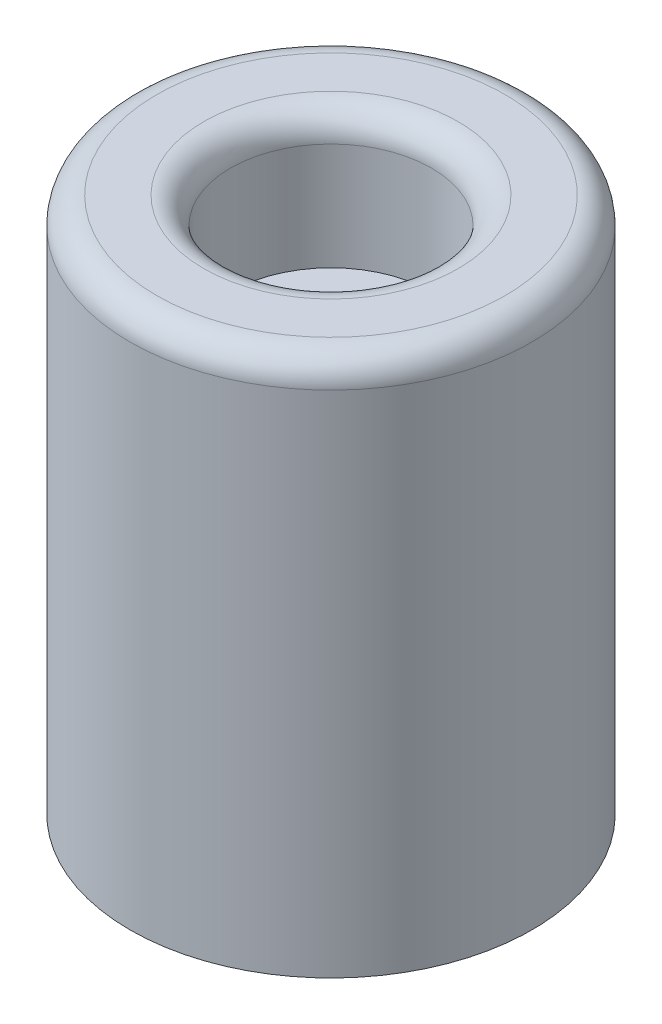
ISO-10303-21;
HEADER;
FILE_DESCRIPTION(('STEP AP214'),'2;1');
FILE_NAME('part.step','',(''),(''),'','','');
FILE_SCHEMA(('AUTOMOTIVE_DESIGN { 1 0 10303 214 1 1 1 1 }'));
ENDSEC;
DATA;
#1=APPLICATION_CONTEXT('core data for automotive mechanical design processes');
#2=APPLICATION_PROTOCOL_DEFINITION('international standard','automotive_design',2000,#1);
#3=PRODUCT_CONTEXT('',#1,'mechanical');
#4=PRODUCT('Part','Part','',(#3));
#5=PRODUCT_RELATED_PRODUCT_CATEGORY('part','',(#4));
#6=PRODUCT_DEFINITION_FORMATION('','',#4);
#7=PRODUCT_DEFINITION_CONTEXT('part definition',#1,'design');
#8=PRODUCT_DEFINITION('design','',#6,#7);
#9=PRODUCT_DEFINITION_SHAPE('','',#8);
#10=(LENGTH_UNIT() NAMED_UNIT(*) SI_UNIT(.MILLI.,.METRE.));
#11=(NAMED_UNIT(*) PLANE_ANGLE_UNIT() SI_UNIT($,.RADIAN.));
#12=(NAMED_UNIT(*) SI_UNIT($,.STERADIAN.) SOLID_ANGLE_UNIT());
#13=UNCERTAINTY_MEASURE_WITH_UNIT(LENGTH_MEASURE(1.E-05),#10,'distance_accuracy_value','');
#14=(GEOMETRIC_REPRESENTATION_CONTEXT(3) GLOBAL_UNCERTAINTY_ASSIGNED_CONTEXT((#13)) GLOBAL_UNIT_ASSIGNED_CONTEXT((#10,
#11,#12)) REPRESENTATION_CONTEXT('',''));
#15=CARTESIAN_POINT('',(0.,0.,0.));
#16=DIRECTION('',(0.,0.,1.));
#17=DIRECTION('',(1.,0.,0.));
#18=AXIS2_PLACEMENT_3D('',#15,#16,#17);
#19=CARTESIAN_POINT('',(0.,25.4,0.));
#20=DIRECTION('',(0.,-1.,0.));
#21=DIRECTION('',(0.,0.,-1.));
#22=AXIS2_PLACEMENT_3D('',#19,#20,#21);
#23=CYLINDRICAL_SURFACE('',#22,9.525);
#24=CARTESIAN_POINT('',(0.,24.13,0.));
#25=DIRECTION('',(0.,1.,0.));
#26=DIRECTION('',(0.,0.,1.));
#27=AXIS2_PLACEMENT_3D('',#24,#25,#26);
#28=CIRCLE('',#27,9.525);
#29=CARTESIAN_POINT('',(0.,24.13,9.525));
#30=VERTEX_POINT('',#29);
#31=EDGE_CURVE('E10',#30,#30,#28,.F.);
#32=ORIENTED_EDGE('',*,*,#31,.T.);
#33=EDGE_LOOP('',(#32));
#34=FACE_BOUND('',#33,.T.);
#35=CARTESIAN_POINT('',(0.,0.,0.));
#36=DIRECTION('',(0.,1.,0.));
#37=DIRECTION('',(0.,0.,1.));
#38=AXIS2_PLACEMENT_3D('',#35,#36,#37);
#39=CIRCLE('',#38,9.525);
#40=CARTESIAN_POINT('',(0.,0.,9.525));
#41=VERTEX_POINT('',#40);
#42=EDGE_CURVE('E52',#41,#41,#39,.T.);
#43=ORIENTED_EDGE('',*,*,#42,.T.);
#44=EDGE_LOOP('',(#43));
#45=FACE_BOUND('',#44,.T.);
#46=ADVANCED_FACE('F32',(#34,#45),#23,.T.);
#47=CARTESIAN_POINT('',(0.,25.4,0.));
#48=DIRECTION('',(0.,1.,0.));
#49=DIRECTION('',(0.,0.,1.));
#50=AXIS2_PLACEMENT_3D('',#47,#48,#49);
#51=PLANE('',#50);
#52=CARTESIAN_POINT('',(0.,25.4,0.));
#53=DIRECTION('',(0.,1.,0.));
#54=DIRECTION('',(0.,0.,1.));
#55=AXIS2_PLACEMENT_3D('',#52,#53,#54);
#56=CIRCLE('',#55,6.0325);
#57=CARTESIAN_POINT('',(0.,25.4,6.0325));
#58=VERTEX_POINT('',#57);
#59=EDGE_CURVE('E39',#58,#58,#56,.F.);
#60=ORIENTED_EDGE('',*,*,#59,.T.);
#61=EDGE_LOOP('',(#60));
#62=FACE_BOUND('',#61,.T.);
#63=CARTESIAN_POINT('',(0.,25.4,0.));
#64=DIRECTION('',(0.,1.,0.));
#65=DIRECTION('',(0.,0.,1.));
#66=AXIS2_PLACEMENT_3D('',#63,#64,#65);
#67=CIRCLE('',#66,8.255);
#68=CARTESIAN_POINT('',(0.,25.4,8.255));
#69=VERTEX_POINT('',#68);
#70=EDGE_CURVE('E43',#69,#69,#67,.T.);
#71=ORIENTED_EDGE('',*,*,#70,.T.);
#72=EDGE_LOOP('',(#71));
#73=FACE_BOUND('',#72,.T.);
#74=ADVANCED_FACE('F88',(#62,#73),#51,.T.);
#75=CARTESIAN_POINT('',(0.,0.,0.));
#76=DIRECTION('',(0.,1.,0.));
#77=DIRECTION('',(0.,0.,1.));
#78=AXIS2_PLACEMENT_3D('',#75,#76,#77);
#79=PLANE('',#78);
#80=CARTESIAN_POINT('',(0.,0.,0.));
#81=DIRECTION('',(0.,1.,0.));
#82=DIRECTION('',(0.,0.,1.));
#83=AXIS2_PLACEMENT_3D('',#80,#81,#82);
#84=CIRCLE('',#83,1.984375);
#85=CARTESIAN_POINT('',(0.,0.,1.984375));
#86=VERTEX_POINT('',#85);
#87=EDGE_CURVE('E58',#86,#86,#84,.T.);
#88=ORIENTED_EDGE('',*,*,#87,.T.);
#89=EDGE_LOOP('',(#88));
#90=FACE_BOUND('',#89,.T.);
#91=ORIENTED_EDGE('',*,*,#42,.F.);
#92=EDGE_LOOP('',(#91));
#93=FACE_BOUND('',#92,.T.);
#94=ADVANCED_FACE('F65',(#90,#93),#79,.F.);
#95=CARTESIAN_POINT('',(0.,19.05,0.));
#96=DIRECTION('',(0.,1.,0.));
#97=DIRECTION('',(0.,0.,1.));
#98=AXIS2_PLACEMENT_3D('',#95,#96,#97);
#99=CYLINDRICAL_SURFACE('',#98,4.7625);
#100=CARTESIAN_POINT('',(0.,24.13,0.));
#101=DIRECTION('',(0.,1.,0.));
#102=DIRECTION('',(0.,0.,1.));
#103=AXIS2_PLACEMENT_3D('',#100,#101,#102);
#104=CIRCLE('',#103,4.7625);
#105=CARTESIAN_POINT('',(0.,24.13,4.7625));
#106=VERTEX_POINT('',#105);
#107=EDGE_CURVE('E47',#106,#106,#104,.T.);
#108=ORIENTED_EDGE('',*,*,#107,.T.);
#109=EDGE_LOOP('',(#108));
#110=FACE_BOUND('',#109,.T.);
#111=CARTESIAN_POINT('',(0.,19.05,0.));
#112=DIRECTION('',(0.,1.,0.));
#113=DIRECTION('',(0.,0.,1.));
#114=AXIS2_PLACEMENT_3D('',#111,#112,#113);
#115=CIRCLE('',#114,4.7625);
#116=CARTESIAN_POINT('',(0.,19.05,4.7625));
#117=VERTEX_POINT('',#116);
#118=EDGE_CURVE('E55',#117,#117,#115,.T.);
#119=ORIENTED_EDGE('',*,*,#118,.F.);
#120=EDGE_LOOP('',(#119));
#121=FACE_BOUND('',#120,.T.);
#122=ADVANCED_FACE('F78',(#110,#121),#99,.F.);
#123=CARTESIAN_POINT('',(0.,19.05,0.));
#124=DIRECTION('',(0.,1.,0.));
#125=DIRECTION('',(0.,0.,1.));
#126=AXIS2_PLACEMENT_3D('',#123,#124,#125);
#127=PLANE('',#126);
#128=CARTESIAN_POINT('',(0.,19.05,0.));
#129=DIRECTION('',(0.,1.,0.));
#130=DIRECTION('',(0.,0.,1.));
#131=AXIS2_PLACEMENT_3D('',#128,#129,#130);
#132=CIRCLE('',#131,1.984375);
#133=CARTESIAN_POINT('',(0.,19.05,1.984375));
#134=VERTEX_POINT('',#133);
#135=EDGE_CURVE('E59',#134,#134,#132,.T.);
#136=ORIENTED_EDGE('',*,*,#135,.F.);
#137=EDGE_LOOP('',(#136));
#138=FACE_BOUND('',#137,.T.);
#139=ORIENTED_EDGE('',*,*,#118,.T.);
#140=EDGE_LOOP('',(#139));
#141=FACE_BOUND('',#140,.T.);
#142=ADVANCED_FACE('F72',(#138,#141),#127,.T.);
#143=CARTESIAN_POINT('',(0.,0.,0.));
#144=DIRECTION('',(0.,1.,0.));
#145=DIRECTION('',(0.,0.,1.));
#146=AXIS2_PLACEMENT_3D('',#143,#144,#145);
#147=CYLINDRICAL_SURFACE('',#146,1.984375);
#148=ORIENTED_EDGE('',*,*,#87,.F.);
#149=EDGE_LOOP('',(#148));
#150=FACE_BOUND('',#149,.T.);
#151=ORIENTED_EDGE('',*,*,#135,.T.);
#152=EDGE_LOOP('',(#151));
#153=FACE_BOUND('',#152,.T.);
#154=ADVANCED_FACE('F68',(#150,#153),#147,.F.);
#155=CARTESIAN_POINT('',(0.,24.13,0.));
#156=DIRECTION('',(0.,1.,0.));
#157=DIRECTION('',(0.,0.,1.));
#158=AXIS2_PLACEMENT_3D('',#155,#156,#157);
#159=TOROIDAL_SURFACE('',#158,6.0325,1.27);
#160=ORIENTED_EDGE('',*,*,#59,.F.);
#161=EDGE_LOOP('',(#160));
#162=FACE_BOUND('',#161,.T.);
#163=ORIENTED_EDGE('',*,*,#107,.F.);
#164=EDGE_LOOP('',(#163));
#165=FACE_BOUND('',#164,.T.);
#166=ADVANCED_FACE('F71',(#162,#165),#159,.T.);
#167=CARTESIAN_POINT('',(0.,24.13,0.));
#168=DIRECTION('',(0.,1.,0.));
#169=DIRECTION('',(0.,0.,1.));
#170=AXIS2_PLACEMENT_3D('',#167,#168,#169);
#171=TOROIDAL_SURFACE('',#170,8.255,1.27);
#172=ORIENTED_EDGE('',*,*,#31,.F.);
#173=EDGE_LOOP('',(#172));
#174=FACE_BOUND('',#173,.T.);
#175=ORIENTED_EDGE('',*,*,#70,.F.);
#176=EDGE_LOOP('',(#175));
#177=FACE_BOUND('',#176,.T.);
#178=ADVANCED_FACE('F34',(#174,#177),#171,.T.);
#179=CLOSED_SHELL('',(#46,#74,#94,#122,#142,#154,#166,#178));
#180=MANIFOLD_SOLID_BREP('B2',#179);
#181=ADVANCED_BREP_SHAPE_REPRESENTATION('',(#18,#180),#14);
#182=SHAPE_DEFINITION_REPRESENTATION(#9,#181);
ENDSEC;
END-ISO-10303-21;
